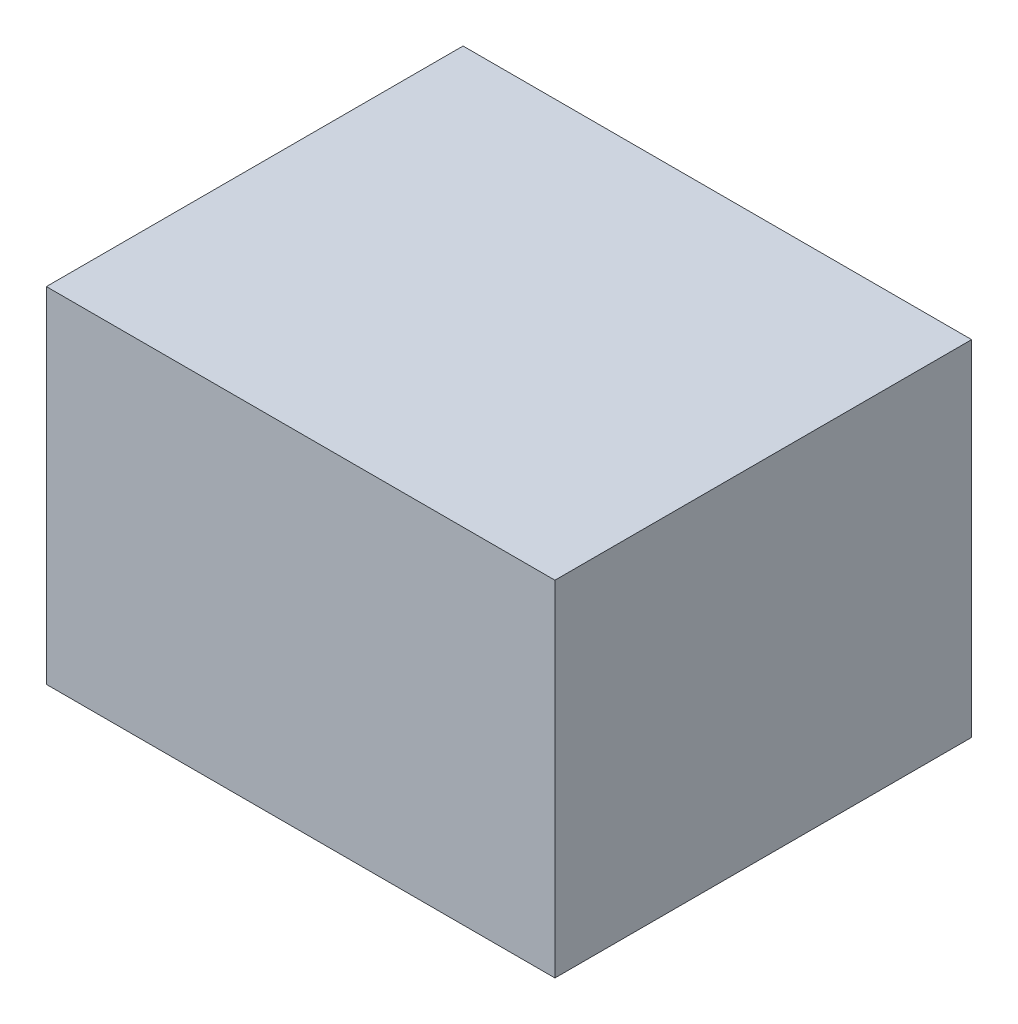
ISO-10303-21;
HEADER;
FILE_DESCRIPTION(('STEP AP214'),'2;1');
FILE_NAME('part.step','',(''),(''),'','','');
FILE_SCHEMA(('AUTOMOTIVE_DESIGN { 1 0 10303 214 1 1 1 1 }'));
ENDSEC;
DATA;
#1=APPLICATION_CONTEXT('core data for automotive mechanical design processes');
#2=APPLICATION_PROTOCOL_DEFINITION('international standard','automotive_design',2000,#1);
#3=PRODUCT_CONTEXT('',#1,'mechanical');
#4=PRODUCT('Part','Part','',(#3));
#5=PRODUCT_RELATED_PRODUCT_CATEGORY('part','',(#4));
#6=PRODUCT_DEFINITION_FORMATION('','',#4);
#7=PRODUCT_DEFINITION_CONTEXT('part definition',#1,'design');
#8=PRODUCT_DEFINITION('design','',#6,#7);
#9=PRODUCT_DEFINITION_SHAPE('','',#8);
#10=(LENGTH_UNIT() NAMED_UNIT(*) SI_UNIT(.MILLI.,.METRE.));
#11=(NAMED_UNIT(*) PLANE_ANGLE_UNIT() SI_UNIT($,.RADIAN.));
#12=(NAMED_UNIT(*) SI_UNIT($,.STERADIAN.) SOLID_ANGLE_UNIT());
#13=UNCERTAINTY_MEASURE_WITH_UNIT(LENGTH_MEASURE(1.E-05),#10,'distance_accuracy_value','');
#14=(GEOMETRIC_REPRESENTATION_CONTEXT(3) GLOBAL_UNCERTAINTY_ASSIGNED_CONTEXT((#13)) GLOBAL_UNIT_ASSIGNED_CONTEXT((#10,
#11,#12)) REPRESENTATION_CONTEXT('',''));
#15=CARTESIAN_POINT('',(0.,0.,0.));
#16=DIRECTION('',(0.,0.,1.));
#17=DIRECTION('',(1.,0.,0.));
#18=AXIS2_PLACEMENT_3D('',#15,#16,#17);
#19=CARTESIAN_POINT('',(7.75,5.25,6.35));
#20=DIRECTION('',(-1.,0.,0.));
#21=DIRECTION('',(0.,0.,1.));
#22=AXIS2_PLACEMENT_3D('',#19,#20,#21);
#23=PLANE('',#22);
#24=DIRECTION('',(0.,0.,-1.));
#25=VECTOR('',#24,1.);
#26=CARTESIAN_POINT('',(7.75,-5.25,6.35));
#27=LINE('',#26,#25);
#28=CARTESIAN_POINT('',(7.75,-5.25,6.35));
#29=VERTEX_POINT('',#28);
#30=CARTESIAN_POINT('',(7.75,-5.25,-6.35));
#31=VERTEX_POINT('',#30);
#32=EDGE_CURVE('E107',#29,#31,#27,.T.);
#33=ORIENTED_EDGE('',*,*,#32,.T.);
#34=DIRECTION('',(0.,-1.,0.));
#35=VECTOR('',#34,1.);
#36=CARTESIAN_POINT('',(7.75,5.25,-6.35));
#37=LINE('',#36,#35);
#38=CARTESIAN_POINT('',(7.75,5.25,-6.35));
#39=VERTEX_POINT('',#38);
#40=EDGE_CURVE('E11',#39,#31,#37,.T.);
#41=ORIENTED_EDGE('',*,*,#40,.F.);
#42=DIRECTION('',(0.,0.,-1.));
#43=VECTOR('',#42,1.);
#44=CARTESIAN_POINT('',(7.75,5.25,6.35));
#45=LINE('',#44,#43);
#46=CARTESIAN_POINT('',(7.75,5.25,6.35));
#47=VERTEX_POINT('',#46);
#48=EDGE_CURVE('E91',#47,#39,#45,.T.);
#49=ORIENTED_EDGE('',*,*,#48,.F.);
#50=DIRECTION('',(0.,-1.,0.));
#51=VECTOR('',#50,1.);
#52=CARTESIAN_POINT('',(7.75,5.25,6.35));
#53=LINE('',#52,#51);
#54=EDGE_CURVE('E103',#47,#29,#53,.T.);
#55=ORIENTED_EDGE('',*,*,#54,.T.);
#56=EDGE_LOOP('',(#33,#41,#49,#55));
#57=FACE_BOUND('',#56,.T.);
#58=ADVANCED_FACE('F39',(#57),#23,.F.);
#59=CARTESIAN_POINT('',(-7.75,5.25,-6.35));
#60=DIRECTION('',(0.,0.,1.));
#61=DIRECTION('',(1.,0.,0.));
#62=AXIS2_PLACEMENT_3D('',#59,#60,#61);
#63=PLANE('',#62);
#64=DIRECTION('',(-1.,0.,0.));
#65=VECTOR('',#64,1.);
#66=CARTESIAN_POINT('',(-7.75,-5.25,-6.35));
#67=LINE('',#66,#65);
#68=CARTESIAN_POINT('',(-7.75,-5.25,-6.35));
#69=VERTEX_POINT('',#68);
#70=EDGE_CURVE('E96',#31,#69,#67,.T.);
#71=ORIENTED_EDGE('',*,*,#70,.T.);
#72=DIRECTION('',(0.,-1.,0.));
#73=VECTOR('',#72,1.);
#74=CARTESIAN_POINT('',(-7.75,5.25,-6.35));
#75=LINE('',#74,#73);
#76=CARTESIAN_POINT('',(-7.75,5.25,-6.35));
#77=VERTEX_POINT('',#76);
#78=EDGE_CURVE('E48',#77,#69,#75,.T.);
#79=ORIENTED_EDGE('',*,*,#78,.F.);
#80=DIRECTION('',(-1.,0.,0.));
#81=VECTOR('',#80,1.);
#82=CARTESIAN_POINT('',(-7.75,5.25,-6.35));
#83=LINE('',#82,#81);
#84=EDGE_CURVE('E86',#39,#77,#83,.T.);
#85=ORIENTED_EDGE('',*,*,#84,.F.);
#86=ORIENTED_EDGE('',*,*,#40,.T.);
#87=EDGE_LOOP('',(#71,#79,#85,#86));
#88=FACE_BOUND('',#87,.T.);
#89=ADVANCED_FACE('F95',(#88),#63,.F.);
#90=CARTESIAN_POINT('',(-7.75,5.25,6.35));
#91=DIRECTION('',(1.,0.,0.));
#92=DIRECTION('',(0.,0.,-1.));
#93=AXIS2_PLACEMENT_3D('',#90,#91,#92);
#94=PLANE('',#93);
#95=DIRECTION('',(0.,0.,1.));
#96=VECTOR('',#95,1.);
#97=CARTESIAN_POINT('',(-7.75,-5.25,6.35));
#98=LINE('',#97,#96);
#99=CARTESIAN_POINT('',(-7.75,-5.25,6.35));
#100=VERTEX_POINT('',#99);
#101=EDGE_CURVE('E73',#69,#100,#98,.T.);
#102=ORIENTED_EDGE('',*,*,#101,.T.);
#103=DIRECTION('',(0.,-1.,0.));
#104=VECTOR('',#103,1.);
#105=CARTESIAN_POINT('',(-7.75,5.25,6.35));
#106=LINE('',#105,#104);
#107=CARTESIAN_POINT('',(-7.75,5.25,6.35));
#108=VERTEX_POINT('',#107);
#109=EDGE_CURVE('E98',#108,#100,#106,.T.);
#110=ORIENTED_EDGE('',*,*,#109,.F.);
#111=DIRECTION('',(0.,0.,1.));
#112=VECTOR('',#111,1.);
#113=CARTESIAN_POINT('',(-7.75,5.25,6.35));
#114=LINE('',#113,#112);
#115=EDGE_CURVE('E89',#77,#108,#114,.T.);
#116=ORIENTED_EDGE('',*,*,#115,.F.);
#117=ORIENTED_EDGE('',*,*,#78,.T.);
#118=EDGE_LOOP('',(#102,#110,#116,#117));
#119=FACE_BOUND('',#118,.T.);
#120=ADVANCED_FACE('F99',(#119),#94,.F.);
#121=CARTESIAN_POINT('',(-7.75,5.25,6.35));
#122=DIRECTION('',(0.,0.,-1.));
#123=DIRECTION('',(-1.,0.,0.));
#124=AXIS2_PLACEMENT_3D('',#121,#122,#123);
#125=PLANE('',#124);
#126=DIRECTION('',(1.,0.,0.));
#127=VECTOR('',#126,1.);
#128=CARTESIAN_POINT('',(-7.75,-5.25,6.35));
#129=LINE('',#128,#127);
#130=EDGE_CURVE('E79',#100,#29,#129,.T.);
#131=ORIENTED_EDGE('',*,*,#130,.T.);
#132=ORIENTED_EDGE('',*,*,#54,.F.);
#133=DIRECTION('',(1.,0.,0.));
#134=VECTOR('',#133,1.);
#135=CARTESIAN_POINT('',(-7.75,5.25,6.35));
#136=LINE('',#135,#134);
#137=EDGE_CURVE('E56',#108,#47,#136,.T.);
#138=ORIENTED_EDGE('',*,*,#137,.F.);
#139=ORIENTED_EDGE('',*,*,#109,.T.);
#140=EDGE_LOOP('',(#131,#132,#138,#139));
#141=FACE_BOUND('',#140,.T.);
#142=ADVANCED_FACE('F120',(#141),#125,.F.);
#143=CARTESIAN_POINT('',(0.,5.25,0.));
#144=DIRECTION('',(0.,-1.,0.));
#145=DIRECTION('',(0.,0.,-1.));
#146=AXIS2_PLACEMENT_3D('',#143,#144,#145);
#147=PLANE('',#146);
#148=ORIENTED_EDGE('',*,*,#48,.T.);
#149=ORIENTED_EDGE('',*,*,#84,.T.);
#150=ORIENTED_EDGE('',*,*,#115,.T.);
#151=ORIENTED_EDGE('',*,*,#137,.T.);
#152=EDGE_LOOP('',(#148,#149,#150,#151));
#153=FACE_BOUND('',#152,.T.);
#154=ADVANCED_FACE('F87',(#153),#147,.F.);
#155=CARTESIAN_POINT('',(0.,-5.25,0.));
#156=DIRECTION('',(0.,-1.,0.));
#157=DIRECTION('',(0.,0.,-1.));
#158=AXIS2_PLACEMENT_3D('',#155,#156,#157);
#159=PLANE('',#158);
#160=ORIENTED_EDGE('',*,*,#32,.F.);
#161=ORIENTED_EDGE('',*,*,#130,.F.);
#162=ORIENTED_EDGE('',*,*,#101,.F.);
#163=ORIENTED_EDGE('',*,*,#70,.F.);
#164=EDGE_LOOP('',(#160,#161,#162,#163));
#165=FACE_BOUND('',#164,.T.);
#166=ADVANCED_FACE('F123',(#165),#159,.T.);
#167=CLOSED_SHELL('',(#58,#89,#120,#142,#154,#166));
#168=MANIFOLD_SOLID_BREP('B2',#167);
#169=ADVANCED_BREP_SHAPE_REPRESENTATION('',(#18,#168),#14);
#170=SHAPE_DEFINITION_REPRESENTATION(#9,#169);
ENDSEC;
END-ISO-10303-21;
